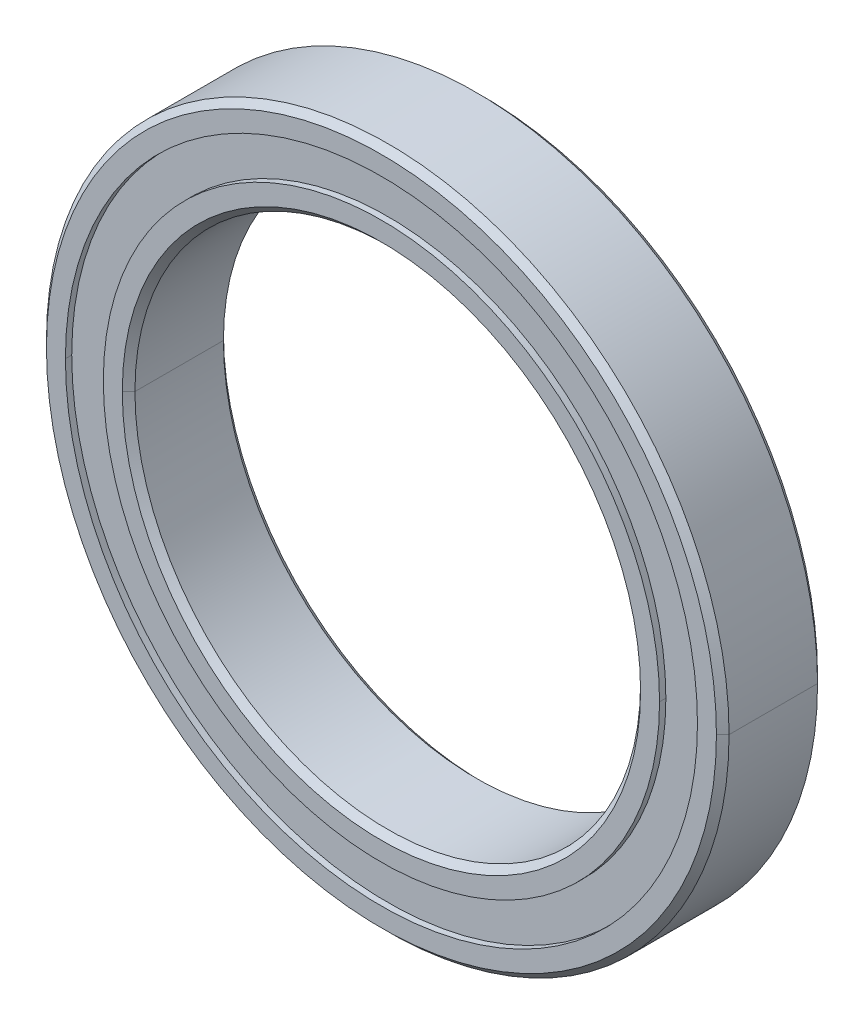
ISO-10303-21;
HEADER;
FILE_DESCRIPTION(('STEP AP214'),'2;1');
FILE_NAME('part.step','',(''),(''),'','','');
FILE_SCHEMA(('AUTOMOTIVE_DESIGN { 1 0 10303 214 1 1 1 1 }'));
ENDSEC;
DATA;
#1=APPLICATION_CONTEXT('core data for automotive mechanical design processes');
#2=APPLICATION_PROTOCOL_DEFINITION('international standard','automotive_design',2000,#1);
#3=PRODUCT_CONTEXT('',#1,'mechanical');
#4=PRODUCT('Part','Part','',(#3));
#5=PRODUCT_RELATED_PRODUCT_CATEGORY('part','',(#4));
#6=PRODUCT_DEFINITION_FORMATION('','',#4);
#7=PRODUCT_DEFINITION_CONTEXT('part definition',#1,'design');
#8=PRODUCT_DEFINITION('design','',#6,#7);
#9=PRODUCT_DEFINITION_SHAPE('','',#8);
#10=(LENGTH_UNIT() NAMED_UNIT(*) SI_UNIT(.MILLI.,.METRE.));
#11=(NAMED_UNIT(*) PLANE_ANGLE_UNIT() SI_UNIT($,.RADIAN.));
#12=(NAMED_UNIT(*) SI_UNIT($,.STERADIAN.) SOLID_ANGLE_UNIT());
#13=UNCERTAINTY_MEASURE_WITH_UNIT(LENGTH_MEASURE(1.E-05),#10,'distance_accuracy_value','');
#14=(GEOMETRIC_REPRESENTATION_CONTEXT(3) GLOBAL_UNCERTAINTY_ASSIGNED_CONTEXT((#13)) GLOBAL_UNIT_ASSIGNED_CONTEXT((#10,
#11,#12)) REPRESENTATION_CONTEXT('',''));
#15=CARTESIAN_POINT('',(0.,0.,0.));
#16=DIRECTION('',(0.,0.,1.));
#17=DIRECTION('',(1.,0.,0.));
#18=AXIS2_PLACEMENT_3D('',#15,#16,#17);
#19=CARTESIAN_POINT('',(0.,0.,2.));
#20=DIRECTION('',(0.,0.,-1.));
#21=DIRECTION('',(-1.,0.,0.));
#22=AXIS2_PLACEMENT_3D('',#19,#20,#21);
#23=CONICAL_SURFACE('',#22,13.2500000000001,0.785398163397435);
#24=DIRECTION('',(0.707106781186541,0.,-0.707106781186554));
#25=VECTOR('',#24,1.);
#26=CARTESIAN_POINT('',(13.2500000000001,0.,2.));
#27=LINE('',#26,#25);
#28=CARTESIAN_POINT('',(13.25,0.,2.));
#29=VERTEX_POINT('',#28);
#30=CARTESIAN_POINT('',(13.5,0.,1.75));
#31=VERTEX_POINT('',#30);
#32=EDGE_CURVE('E216',#29,#31,#27,.T.);
#33=ORIENTED_EDGE('',*,*,#32,.F.);
#34=CARTESIAN_POINT('',(0.,0.,2.));
#35=DIRECTION('',(0.,0.,1.));
#36=DIRECTION('',(1.,0.,0.));
#37=AXIS2_PLACEMENT_3D('',#34,#35,#36);
#38=CIRCLE('',#37,13.2500000000001);
#39=CARTESIAN_POINT('',(-13.25,0.,2.));
#40=VERTEX_POINT('',#39);
#41=EDGE_CURVE('E276',#40,#29,#38,.T.);
#42=ORIENTED_EDGE('',*,*,#41,.F.);
#43=DIRECTION('',(-0.707106781186541,0.,-0.707106781186554));
#44=VECTOR('',#43,1.);
#45=CARTESIAN_POINT('',(-13.2500000000001,0.,2.));
#46=LINE('',#45,#44);
#47=CARTESIAN_POINT('',(-13.5,0.,1.75));
#48=VERTEX_POINT('',#47);
#49=EDGE_CURVE('E215',#40,#48,#46,.T.);
#50=ORIENTED_EDGE('',*,*,#49,.T.);
#51=CARTESIAN_POINT('',(0.,0.,1.75));
#52=DIRECTION('',(0.,0.,-1.));
#53=DIRECTION('',(1.,0.,0.));
#54=AXIS2_PLACEMENT_3D('',#51,#52,#53);
#55=CIRCLE('',#54,13.5000000000001);
#56=EDGE_CURVE('E148',#31,#48,#55,.T.);
#57=ORIENTED_EDGE('',*,*,#56,.F.);
#58=EDGE_LOOP('',(#33,#42,#50,#57));
#59=FACE_BOUND('',#58,.T.);
#60=ADVANCED_FACE('F16',(#59),#23,.T.);
#61=CARTESIAN_POINT('',(0.,0.,-1.75));
#62=DIRECTION('',(0.,0.,1.));
#63=DIRECTION('',(1.,0.,0.));
#64=AXIS2_PLACEMENT_3D('',#61,#62,#63);
#65=CONICAL_SURFACE('',#64,13.5000000000001,0.785398163397452);
#66=DIRECTION('',(-0.707106781186554,0.,0.707106781186542));
#67=VECTOR('',#66,1.);
#68=CARTESIAN_POINT('',(-13.5000000000001,0.,-1.75));
#69=LINE('',#68,#67);
#70=CARTESIAN_POINT('',(-13.25,0.,-2.));
#71=VERTEX_POINT('',#70);
#72=CARTESIAN_POINT('',(-13.5,0.,-1.75));
#73=VERTEX_POINT('',#72);
#74=EDGE_CURVE('E279',#71,#73,#69,.T.);
#75=ORIENTED_EDGE('',*,*,#74,.F.);
#76=CARTESIAN_POINT('',(0.,0.,-2.));
#77=DIRECTION('',(0.,0.,-1.));
#78=DIRECTION('',(1.,0.,0.));
#79=AXIS2_PLACEMENT_3D('',#76,#77,#78);
#80=CIRCLE('',#79,13.2500000000001);
#81=CARTESIAN_POINT('',(13.2500000000001,0.,-2.));
#82=VERTEX_POINT('',#81);
#83=EDGE_CURVE('E149',#82,#71,#80,.T.);
#84=ORIENTED_EDGE('',*,*,#83,.F.);
#85=DIRECTION('',(0.707106781186554,0.,0.707106781186542));
#86=VECTOR('',#85,1.);
#87=CARTESIAN_POINT('',(13.5000000000001,0.,-1.75));
#88=LINE('',#87,#86);
#89=CARTESIAN_POINT('',(13.5,0.,-1.75));
#90=VERTEX_POINT('',#89);
#91=EDGE_CURVE('E197',#82,#90,#88,.T.);
#92=ORIENTED_EDGE('',*,*,#91,.T.);
#93=CARTESIAN_POINT('',(0.,0.,-1.75));
#94=DIRECTION('',(0.,0.,1.));
#95=DIRECTION('',(1.,0.,0.));
#96=AXIS2_PLACEMENT_3D('',#93,#94,#95);
#97=CIRCLE('',#96,13.5000000000001);
#98=EDGE_CURVE('E283',#73,#90,#97,.T.);
#99=ORIENTED_EDGE('',*,*,#98,.F.);
#100=EDGE_LOOP('',(#75,#84,#92,#99));
#101=FACE_BOUND('',#100,.T.);
#102=ADVANCED_FACE('F18',(#101),#65,.T.);
#103=CARTESIAN_POINT('',(0.,0.,1.75));
#104=DIRECTION('',(0.,0.,1.));
#105=DIRECTION('',(1.,0.,0.));
#106=AXIS2_PLACEMENT_3D('',#103,#104,#105);
#107=CONICAL_SURFACE('',#106,10.,0.785398163397455);
#108=DIRECTION('',(-0.707106781186556,0.,0.707106781186539));
#109=VECTOR('',#108,1.);
#110=CARTESIAN_POINT('',(-10.,0.,1.75));
#111=LINE('',#110,#109);
#112=CARTESIAN_POINT('',(-10.,0.,1.75));
#113=VERTEX_POINT('',#112);
#114=CARTESIAN_POINT('',(-10.25,0.,2.));
#115=VERTEX_POINT('',#114);
#116=EDGE_CURVE('E185',#113,#115,#111,.T.);
#117=ORIENTED_EDGE('',*,*,#116,.F.);
#118=CARTESIAN_POINT('',(0.,0.,1.75));
#119=DIRECTION('',(0.,0.,1.));
#120=DIRECTION('',(1.,0.,0.));
#121=AXIS2_PLACEMENT_3D('',#118,#119,#120);
#122=CIRCLE('',#121,10.);
#123=CARTESIAN_POINT('',(10.,0.,1.75));
#124=VERTEX_POINT('',#123);
#125=EDGE_CURVE('E285',#124,#113,#122,.T.);
#126=ORIENTED_EDGE('',*,*,#125,.F.);
#127=DIRECTION('',(0.707106781186556,0.,0.707106781186539));
#128=VECTOR('',#127,1.);
#129=CARTESIAN_POINT('',(10.,0.,1.75));
#130=LINE('',#129,#128);
#131=CARTESIAN_POINT('',(10.25,0.,2.));
#132=VERTEX_POINT('',#131);
#133=EDGE_CURVE('E184',#124,#132,#130,.T.);
#134=ORIENTED_EDGE('',*,*,#133,.T.);
#135=CARTESIAN_POINT('',(0.,0.,2.));
#136=DIRECTION('',(0.,0.,-1.));
#137=DIRECTION('',(1.,0.,0.));
#138=AXIS2_PLACEMENT_3D('',#135,#136,#137);
#139=CIRCLE('',#138,10.25);
#140=EDGE_CURVE('E249',#115,#132,#139,.T.);
#141=ORIENTED_EDGE('',*,*,#140,.F.);
#142=EDGE_LOOP('',(#117,#126,#134,#141));
#143=FACE_BOUND('',#142,.T.);
#144=ADVANCED_FACE('F369',(#143),#107,.F.);
#145=CARTESIAN_POINT('',(0.,0.,-2.));
#146=DIRECTION('',(0.,0.,-1.));
#147=DIRECTION('',(-1.,0.,0.));
#148=AXIS2_PLACEMENT_3D('',#145,#146,#147);
#149=CONICAL_SURFACE('',#148,10.25,0.785398163397442);
#150=DIRECTION('',(0.707106781186546,0.,-0.707106781186549));
#151=VECTOR('',#150,1.);
#152=CARTESIAN_POINT('',(10.25,0.,-2.));
#153=LINE('',#152,#151);
#154=CARTESIAN_POINT('',(10.,0.,-1.75));
#155=VERTEX_POINT('',#154);
#156=CARTESIAN_POINT('',(10.25,0.,-2.));
#157=VERTEX_POINT('',#156);
#158=EDGE_CURVE('E187',#155,#157,#153,.T.);
#159=ORIENTED_EDGE('',*,*,#158,.F.);
#160=CARTESIAN_POINT('',(0.,0.,-1.75));
#161=DIRECTION('',(0.,0.,-1.));
#162=DIRECTION('',(1.,0.,0.));
#163=AXIS2_PLACEMENT_3D('',#160,#161,#162);
#164=CIRCLE('',#163,10.);
#165=CARTESIAN_POINT('',(-10.,0.,-1.75));
#166=VERTEX_POINT('',#165);
#167=EDGE_CURVE('E339',#166,#155,#164,.T.);
#168=ORIENTED_EDGE('',*,*,#167,.F.);
#169=DIRECTION('',(-0.707106781186546,0.,-0.707106781186549));
#170=VECTOR('',#169,1.);
#171=CARTESIAN_POINT('',(-10.25,0.,-2.));
#172=LINE('',#171,#170);
#173=CARTESIAN_POINT('',(-10.25,0.,-2.));
#174=VERTEX_POINT('',#173);
#175=EDGE_CURVE('E245',#166,#174,#172,.T.);
#176=ORIENTED_EDGE('',*,*,#175,.T.);
#177=CARTESIAN_POINT('',(0.,0.,-2.));
#178=DIRECTION('',(0.,0.,1.));
#179=DIRECTION('',(1.,0.,0.));
#180=AXIS2_PLACEMENT_3D('',#177,#178,#179);
#181=CIRCLE('',#180,10.25);
#182=EDGE_CURVE('E250',#157,#174,#181,.T.);
#183=ORIENTED_EDGE('',*,*,#182,.F.);
#184=EDGE_LOOP('',(#159,#168,#176,#183));
#185=FACE_BOUND('',#184,.T.);
#186=ADVANCED_FACE('F462',(#185),#149,.F.);
#187=CARTESIAN_POINT('',(0.,0.,-1.75));
#188=DIRECTION('',(0.,0.,-1.));
#189=DIRECTION('',(-1.,0.,0.));
#190=AXIS2_PLACEMENT_3D('',#187,#188,#189);
#191=CYLINDRICAL_SURFACE('',#190,11.);
#192=DIRECTION('',(0.,0.,-1.));
#193=VECTOR('',#192,1.);
#194=CARTESIAN_POINT('',(11.,0.,-1.75));
#195=LINE('',#194,#193);
#196=CARTESIAN_POINT('',(11.,0.,-1.75));
#197=VERTEX_POINT('',#196);
#198=CARTESIAN_POINT('',(11.,0.,-2.));
#199=VERTEX_POINT('',#198);
#200=EDGE_CURVE('E244',#197,#199,#195,.T.);
#201=ORIENTED_EDGE('',*,*,#200,.F.);
#202=CARTESIAN_POINT('',(0.,0.,-1.75));
#203=DIRECTION('',(0.,0.,1.));
#204=DIRECTION('',(1.,0.,0.));
#205=AXIS2_PLACEMENT_3D('',#202,#203,#204);
#206=CIRCLE('',#205,11.);
#207=CARTESIAN_POINT('',(-11.,0.,-1.75));
#208=VERTEX_POINT('',#207);
#209=EDGE_CURVE('E11',#208,#197,#206,.T.);
#210=ORIENTED_EDGE('',*,*,#209,.F.);
#211=DIRECTION('',(0.,0.,-1.));
#212=VECTOR('',#211,1.);
#213=CARTESIAN_POINT('',(-11.,0.,-1.75));
#214=LINE('',#213,#212);
#215=CARTESIAN_POINT('',(-11.,0.,-2.));
#216=VERTEX_POINT('',#215);
#217=EDGE_CURVE('E20',#208,#216,#214,.T.);
#218=ORIENTED_EDGE('',*,*,#217,.T.);
#219=CARTESIAN_POINT('',(0.,0.,-2.));
#220=DIRECTION('',(0.,0.,1.));
#221=DIRECTION('',(1.,0.,0.));
#222=AXIS2_PLACEMENT_3D('',#219,#220,#221);
#223=CIRCLE('',#222,11.);
#224=EDGE_CURVE('E310',#216,#199,#223,.T.);
#225=ORIENTED_EDGE('',*,*,#224,.T.);
#226=EDGE_LOOP('',(#201,#210,#218,#225));
#227=FACE_BOUND('',#226,.T.);
#228=ADVANCED_FACE('F373',(#227),#191,.T.);
#229=CARTESIAN_POINT('',(0.,0.,-1.75));
#230=DIRECTION('',(0.,0.,-1.));
#231=DIRECTION('',(-1.,0.,0.));
#232=AXIS2_PLACEMENT_3D('',#229,#230,#231);
#233=CYLINDRICAL_SURFACE('',#232,12.5000000000001);
#234=DIRECTION('',(0.,0.,-1.));
#235=VECTOR('',#234,1.);
#236=CARTESIAN_POINT('',(12.5000000000001,0.,-1.75));
#237=LINE('',#236,#235);
#238=CARTESIAN_POINT('',(12.5,0.,-1.75));
#239=VERTEX_POINT('',#238);
#240=CARTESIAN_POINT('',(12.5,0.,-2.));
#241=VERTEX_POINT('',#240);
#242=EDGE_CURVE('E141',#239,#241,#237,.T.);
#243=ORIENTED_EDGE('',*,*,#242,.F.);
#244=CARTESIAN_POINT('',(0.,0.,-1.75));
#245=DIRECTION('',(0.,0.,1.));
#246=DIRECTION('',(1.,0.,0.));
#247=AXIS2_PLACEMENT_3D('',#244,#245,#246);
#248=CIRCLE('',#247,12.5000000000001);
#249=CARTESIAN_POINT('',(-12.5,0.,-1.75));
#250=VERTEX_POINT('',#249);
#251=EDGE_CURVE('E27',#239,#250,#248,.T.);
#252=ORIENTED_EDGE('',*,*,#251,.T.);
#253=DIRECTION('',(0.,0.,-1.));
#254=VECTOR('',#253,1.);
#255=CARTESIAN_POINT('',(-12.5000000000001,0.,-1.75));
#256=LINE('',#255,#254);
#257=CARTESIAN_POINT('',(-12.5,0.,-2.));
#258=VERTEX_POINT('',#257);
#259=EDGE_CURVE('E144',#250,#258,#256,.T.);
#260=ORIENTED_EDGE('',*,*,#259,.T.);
#261=CARTESIAN_POINT('',(0.,0.,-2.));
#262=DIRECTION('',(0.,0.,1.));
#263=DIRECTION('',(1.,0.,0.));
#264=AXIS2_PLACEMENT_3D('',#261,#262,#263);
#265=CIRCLE('',#264,12.5000000000001);
#266=EDGE_CURVE('E136',#241,#258,#265,.T.);
#267=ORIENTED_EDGE('',*,*,#266,.F.);
#268=EDGE_LOOP('',(#243,#252,#260,#267));
#269=FACE_BOUND('',#268,.T.);
#270=ADVANCED_FACE('F138',(#269),#233,.F.);
#271=CARTESIAN_POINT('',(0.,0.,-1.75));
#272=DIRECTION('',(0.,0.,-1.));
#273=DIRECTION('',(-1.,0.,0.));
#274=AXIS2_PLACEMENT_3D('',#271,#272,#273);
#275=PLANE('',#274);
#276=ORIENTED_EDGE('',*,*,#209,.T.);
#277=CARTESIAN_POINT('',(0.,0.,-1.75));
#278=DIRECTION('',(0.,0.,1.));
#279=DIRECTION('',(1.,0.,0.));
#280=AXIS2_PLACEMENT_3D('',#277,#278,#279);
#281=CIRCLE('',#280,11.);
#282=EDGE_CURVE('E240',#197,#208,#281,.T.);
#283=ORIENTED_EDGE('',*,*,#282,.T.);
#284=EDGE_LOOP('',(#276,#283));
#285=FACE_BOUND('',#284,.T.);
#286=CARTESIAN_POINT('',(0.,0.,-1.75));
#287=DIRECTION('',(0.,0.,1.));
#288=DIRECTION('',(1.,0.,0.));
#289=AXIS2_PLACEMENT_3D('',#286,#287,#288);
#290=CIRCLE('',#289,12.5000000000001);
#291=EDGE_CURVE('E159',#250,#239,#290,.T.);
#292=ORIENTED_EDGE('',*,*,#291,.F.);
#293=ORIENTED_EDGE('',*,*,#251,.F.);
#294=EDGE_LOOP('',(#292,#293));
#295=FACE_BOUND('',#294,.T.);
#296=ADVANCED_FACE('F386',(#285,#295),#275,.T.);
#297=CARTESIAN_POINT('',(0.,0.,1.75));
#298=DIRECTION('',(0.,0.,1.));
#299=DIRECTION('',(1.,0.,0.));
#300=AXIS2_PLACEMENT_3D('',#297,#298,#299);
#301=CYLINDRICAL_SURFACE('',#300,11.);
#302=DIRECTION('',(0.,0.,1.));
#303=VECTOR('',#302,1.);
#304=CARTESIAN_POINT('',(-11.,0.,1.75));
#305=LINE('',#304,#303);
#306=CARTESIAN_POINT('',(-11.,0.,1.75));
#307=VERTEX_POINT('',#306);
#308=CARTESIAN_POINT('',(-11.,0.,2.));
#309=VERTEX_POINT('',#308);
#310=EDGE_CURVE('E201',#307,#309,#305,.T.);
#311=ORIENTED_EDGE('',*,*,#310,.F.);
#312=CARTESIAN_POINT('',(0.,0.,1.75));
#313=DIRECTION('',(0.,0.,1.));
#314=DIRECTION('',(1.,0.,0.));
#315=AXIS2_PLACEMENT_3D('',#312,#313,#314);
#316=CIRCLE('',#315,11.);
#317=CARTESIAN_POINT('',(11.,0.,1.75));
#318=VERTEX_POINT('',#317);
#319=EDGE_CURVE('E172',#307,#318,#316,.T.);
#320=ORIENTED_EDGE('',*,*,#319,.T.);
#321=DIRECTION('',(0.,0.,1.));
#322=VECTOR('',#321,1.);
#323=CARTESIAN_POINT('',(11.,0.,1.75));
#324=LINE('',#323,#322);
#325=CARTESIAN_POINT('',(11.,0.,2.));
#326=VERTEX_POINT('',#325);
#327=EDGE_CURVE('E175',#318,#326,#324,.T.);
#328=ORIENTED_EDGE('',*,*,#327,.T.);
#329=CARTESIAN_POINT('',(0.,0.,2.));
#330=DIRECTION('',(0.,0.,1.));
#331=DIRECTION('',(1.,0.,0.));
#332=AXIS2_PLACEMENT_3D('',#329,#330,#331);
#333=CIRCLE('',#332,11.);
#334=EDGE_CURVE('E246',#309,#326,#333,.T.);
#335=ORIENTED_EDGE('',*,*,#334,.F.);
#336=EDGE_LOOP('',(#311,#320,#328,#335));
#337=FACE_BOUND('',#336,.T.);
#338=ADVANCED_FACE('F381',(#337),#301,.T.);
#339=CARTESIAN_POINT('',(0.,0.,1.75));
#340=DIRECTION('',(0.,0.,1.));
#341=DIRECTION('',(0.,-1.,0.));
#342=AXIS2_PLACEMENT_3D('',#339,#340,#341);
#343=PLANE('',#342);
#344=CARTESIAN_POINT('',(0.,0.,1.75));
#345=DIRECTION('',(0.,0.,1.));
#346=DIRECTION('',(1.,0.,0.));
#347=AXIS2_PLACEMENT_3D('',#344,#345,#346);
#348=CIRCLE('',#347,11.);
#349=EDGE_CURVE('E239',#318,#307,#348,.T.);
#350=ORIENTED_EDGE('',*,*,#349,.F.);
#351=ORIENTED_EDGE('',*,*,#319,.F.);
#352=EDGE_LOOP('',(#350,#351));
#353=FACE_BOUND('',#352,.T.);
#354=CARTESIAN_POINT('',(0.,0.,1.75));
#355=DIRECTION('',(0.,0.,1.));
#356=DIRECTION('',(1.,0.,0.));
#357=AXIS2_PLACEMENT_3D('',#354,#355,#356);
#358=CIRCLE('',#357,12.5000000000001);
#359=CARTESIAN_POINT('',(12.5000000000001,0.,1.75));
#360=VERTEX_POINT('',#359);
#361=CARTESIAN_POINT('',(-12.5,0.,1.75));
#362=VERTEX_POINT('',#361);
#363=EDGE_CURVE('E174',#360,#362,#358,.T.);
#364=ORIENTED_EDGE('',*,*,#363,.T.);
#365=CARTESIAN_POINT('',(0.,0.,1.75));
#366=DIRECTION('',(0.,0.,1.));
#367=DIRECTION('',(1.,0.,0.));
#368=AXIS2_PLACEMENT_3D('',#365,#366,#367);
#369=CIRCLE('',#368,12.5000000000001);
#370=EDGE_CURVE('E179',#362,#360,#369,.T.);
#371=ORIENTED_EDGE('',*,*,#370,.T.);
#372=EDGE_LOOP('',(#364,#371));
#373=FACE_BOUND('',#372,.T.);
#374=ADVANCED_FACE('F378',(#353,#373),#343,.T.);
#375=CARTESIAN_POINT('',(0.,0.,1.75));
#376=DIRECTION('',(0.,0.,1.));
#377=DIRECTION('',(1.,0.,0.));
#378=AXIS2_PLACEMENT_3D('',#375,#376,#377);
#379=CYLINDRICAL_SURFACE('',#378,12.5000000000001);
#380=DIRECTION('',(0.,0.,1.));
#381=VECTOR('',#380,1.);
#382=CARTESIAN_POINT('',(-12.5000000000001,0.,1.75));
#383=LINE('',#382,#381);
#384=CARTESIAN_POINT('',(-12.5,0.,2.));
#385=VERTEX_POINT('',#384);
#386=EDGE_CURVE('E221',#362,#385,#383,.T.);
#387=ORIENTED_EDGE('',*,*,#386,.F.);
#388=ORIENTED_EDGE('',*,*,#363,.F.);
#389=DIRECTION('',(0.,0.,1.));
#390=VECTOR('',#389,1.);
#391=CARTESIAN_POINT('',(12.5000000000001,0.,1.75));
#392=LINE('',#391,#390);
#393=CARTESIAN_POINT('',(12.5000000000001,0.,2.));
#394=VERTEX_POINT('',#393);
#395=EDGE_CURVE('E226',#360,#394,#392,.T.);
#396=ORIENTED_EDGE('',*,*,#395,.T.);
#397=CARTESIAN_POINT('',(0.,0.,2.));
#398=DIRECTION('',(0.,0.,1.));
#399=DIRECTION('',(1.,0.,0.));
#400=AXIS2_PLACEMENT_3D('',#397,#398,#399);
#401=CIRCLE('',#400,12.5000000000001);
#402=EDGE_CURVE('E41',#394,#385,#401,.T.);
#403=ORIENTED_EDGE('',*,*,#402,.T.);
#404=EDGE_LOOP('',(#387,#388,#396,#403));
#405=FACE_BOUND('',#404,.T.);
#406=ADVANCED_FACE('F375',(#405),#379,.F.);
#407=CARTESIAN_POINT('',(0.,0.,2.));
#408=DIRECTION('',(0.,0.,-1.));
#409=DIRECTION('',(-1.,0.,0.));
#410=AXIS2_PLACEMENT_3D('',#407,#408,#409);
#411=CYLINDRICAL_SURFACE('',#410,10.);
#412=DIRECTION('',(0.,0.,-1.));
#413=VECTOR('',#412,1.);
#414=CARTESIAN_POINT('',(10.,0.,2.));
#415=LINE('',#414,#413);
#416=EDGE_CURVE('E222',#124,#155,#415,.T.);
#417=ORIENTED_EDGE('',*,*,#416,.F.);
#418=ORIENTED_EDGE('',*,*,#125,.T.);
#419=DIRECTION('',(0.,0.,-1.));
#420=VECTOR('',#419,1.);
#421=CARTESIAN_POINT('',(-10.,0.,2.));
#422=LINE('',#421,#420);
#423=EDGE_CURVE('E170',#113,#166,#422,.T.);
#424=ORIENTED_EDGE('',*,*,#423,.T.);
#425=ORIENTED_EDGE('',*,*,#167,.T.);
#426=EDGE_LOOP('',(#417,#418,#424,#425));
#427=FACE_BOUND('',#426,.T.);
#428=ADVANCED_FACE('F359',(#427),#411,.F.);
#429=CARTESIAN_POINT('',(0.,0.,2.));
#430=DIRECTION('',(0.,0.,-1.));
#431=DIRECTION('',(-1.,0.,0.));
#432=AXIS2_PLACEMENT_3D('',#429,#430,#431);
#433=CYLINDRICAL_SURFACE('',#432,13.5000000000001);
#434=DIRECTION('',(0.,0.,-1.));
#435=VECTOR('',#434,1.);
#436=CARTESIAN_POINT('',(13.5000000000001,0.,2.));
#437=LINE('',#436,#435);
#438=EDGE_CURVE('E205',#31,#90,#437,.T.);
#439=ORIENTED_EDGE('',*,*,#438,.F.);
#440=ORIENTED_EDGE('',*,*,#56,.T.);
#441=DIRECTION('',(0.,0.,-1.));
#442=VECTOR('',#441,1.);
#443=CARTESIAN_POINT('',(-13.5000000000001,0.,2.));
#444=LINE('',#443,#442);
#445=EDGE_CURVE('E209',#48,#73,#444,.T.);
#446=ORIENTED_EDGE('',*,*,#445,.T.);
#447=ORIENTED_EDGE('',*,*,#98,.T.);
#448=EDGE_LOOP('',(#439,#440,#446,#447));
#449=FACE_BOUND('',#448,.T.);
#450=ADVANCED_FACE('F307',(#449),#433,.T.);
#451=CARTESIAN_POINT('',(0.,0.,-2.));
#452=DIRECTION('',(0.,0.,1.));
#453=DIRECTION('',(0.,-1.,0.));
#454=AXIS2_PLACEMENT_3D('',#451,#452,#453);
#455=PLANE('',#454);
#456=CARTESIAN_POINT('',(0.,0.,-2.));
#457=DIRECTION('',(0.,0.,1.));
#458=DIRECTION('',(1.,0.,0.));
#459=AXIS2_PLACEMENT_3D('',#456,#457,#458);
#460=CIRCLE('',#459,12.5000000000001);
#461=EDGE_CURVE('E151',#258,#241,#460,.T.);
#462=ORIENTED_EDGE('',*,*,#461,.T.);
#463=ORIENTED_EDGE('',*,*,#266,.T.);
#464=EDGE_LOOP('',(#462,#463));
#465=FACE_BOUND('',#464,.T.);
#466=ORIENTED_EDGE('',*,*,#83,.T.);
#467=CARTESIAN_POINT('',(0.,0.,-2.));
#468=DIRECTION('',(0.,0.,-1.));
#469=DIRECTION('',(1.,0.,0.));
#470=AXIS2_PLACEMENT_3D('',#467,#468,#469);
#471=CIRCLE('',#470,13.2500000000001);
#472=EDGE_CURVE('E275',#71,#82,#471,.T.);
#473=ORIENTED_EDGE('',*,*,#472,.T.);
#474=EDGE_LOOP('',(#466,#473));
#475=FACE_BOUND('',#474,.T.);
#476=ADVANCED_FACE('F152',(#465,#475),#455,.F.);
#477=CARTESIAN_POINT('',(0.,0.,2.));
#478=DIRECTION('',(0.,0.,1.));
#479=DIRECTION('',(0.,-1.,0.));
#480=AXIS2_PLACEMENT_3D('',#477,#478,#479);
#481=PLANE('',#480);
#482=ORIENTED_EDGE('',*,*,#402,.F.);
#483=CARTESIAN_POINT('',(0.,0.,2.));
#484=DIRECTION('',(0.,0.,1.));
#485=DIRECTION('',(1.,0.,0.));
#486=AXIS2_PLACEMENT_3D('',#483,#484,#485);
#487=CIRCLE('',#486,12.5000000000001);
#488=EDGE_CURVE('E229',#385,#394,#487,.T.);
#489=ORIENTED_EDGE('',*,*,#488,.F.);
#490=EDGE_LOOP('',(#482,#489));
#491=FACE_BOUND('',#490,.T.);
#492=ORIENTED_EDGE('',*,*,#41,.T.);
#493=CARTESIAN_POINT('',(0.,0.,2.));
#494=DIRECTION('',(0.,0.,1.));
#495=DIRECTION('',(1.,0.,0.));
#496=AXIS2_PLACEMENT_3D('',#493,#494,#495);
#497=CIRCLE('',#496,13.2500000000001);
#498=EDGE_CURVE('E340',#29,#40,#497,.T.);
#499=ORIENTED_EDGE('',*,*,#498,.T.);
#500=EDGE_LOOP('',(#492,#499));
#501=FACE_BOUND('',#500,.T.);
#502=ADVANCED_FACE('F350',(#491,#501),#481,.T.);
#503=CARTESIAN_POINT('',(0.,0.,2.));
#504=DIRECTION('',(0.,0.,1.));
#505=DIRECTION('',(0.,-1.,0.));
#506=AXIS2_PLACEMENT_3D('',#503,#504,#505);
#507=PLANE('',#506);
#508=CARTESIAN_POINT('',(0.,0.,2.));
#509=DIRECTION('',(0.,0.,-1.));
#510=DIRECTION('',(1.,0.,0.));
#511=AXIS2_PLACEMENT_3D('',#508,#509,#510);
#512=CIRCLE('',#511,10.25);
#513=EDGE_CURVE('E181',#132,#115,#512,.T.);
#514=ORIENTED_EDGE('',*,*,#513,.T.);
#515=ORIENTED_EDGE('',*,*,#140,.T.);
#516=EDGE_LOOP('',(#514,#515));
#517=FACE_BOUND('',#516,.T.);
#518=CARTESIAN_POINT('',(0.,0.,2.));
#519=DIRECTION('',(0.,0.,1.));
#520=DIRECTION('',(1.,0.,0.));
#521=AXIS2_PLACEMENT_3D('',#518,#519,#520);
#522=CIRCLE('',#521,11.);
#523=EDGE_CURVE('E180',#326,#309,#522,.T.);
#524=ORIENTED_EDGE('',*,*,#523,.T.);
#525=ORIENTED_EDGE('',*,*,#334,.T.);
#526=EDGE_LOOP('',(#524,#525));
#527=FACE_BOUND('',#526,.T.);
#528=ADVANCED_FACE('F357',(#517,#527),#507,.T.);
#529=CARTESIAN_POINT('',(0.,0.,-2.));
#530=DIRECTION('',(0.,0.,1.));
#531=DIRECTION('',(0.,-1.,0.));
#532=AXIS2_PLACEMENT_3D('',#529,#530,#531);
#533=PLANE('',#532);
#534=CARTESIAN_POINT('',(0.,0.,-2.));
#535=DIRECTION('',(0.,0.,1.));
#536=DIRECTION('',(1.,0.,0.));
#537=AXIS2_PLACEMENT_3D('',#534,#535,#536);
#538=CIRCLE('',#537,10.25);
#539=EDGE_CURVE('E191',#174,#157,#538,.T.);
#540=ORIENTED_EDGE('',*,*,#539,.T.);
#541=ORIENTED_EDGE('',*,*,#182,.T.);
#542=EDGE_LOOP('',(#540,#541));
#543=FACE_BOUND('',#542,.T.);
#544=ORIENTED_EDGE('',*,*,#224,.F.);
#545=CARTESIAN_POINT('',(0.,0.,-2.));
#546=DIRECTION('',(0.,0.,1.));
#547=DIRECTION('',(1.,0.,0.));
#548=AXIS2_PLACEMENT_3D('',#545,#546,#547);
#549=CIRCLE('',#548,11.);
#550=EDGE_CURVE('E253',#199,#216,#549,.T.);
#551=ORIENTED_EDGE('',*,*,#550,.F.);
#552=EDGE_LOOP('',(#544,#551));
#553=FACE_BOUND('',#552,.T.);
#554=ADVANCED_FACE('F401',(#543,#553),#533,.F.);
#555=CARTESIAN_POINT('',(0.,0.,2.));
#556=DIRECTION('',(0.,0.,-1.));
#557=DIRECTION('',(-1.,0.,0.));
#558=AXIS2_PLACEMENT_3D('',#555,#556,#557);
#559=CYLINDRICAL_SURFACE('',#558,13.5000000000001);
#560=CARTESIAN_POINT('',(0.,0.,1.75));
#561=DIRECTION('',(0.,0.,-1.));
#562=DIRECTION('',(1.,0.,0.));
#563=AXIS2_PLACEMENT_3D('',#560,#561,#562);
#564=CIRCLE('',#563,13.5000000000001);
#565=EDGE_CURVE('E212',#48,#31,#564,.T.);
#566=ORIENTED_EDGE('',*,*,#565,.T.);
#567=ORIENTED_EDGE('',*,*,#438,.T.);
#568=CARTESIAN_POINT('',(0.,0.,-1.75));
#569=DIRECTION('',(0.,0.,1.));
#570=DIRECTION('',(1.,0.,0.));
#571=AXIS2_PLACEMENT_3D('',#568,#569,#570);
#572=CIRCLE('',#571,13.5000000000001);
#573=EDGE_CURVE('E233',#90,#73,#572,.T.);
#574=ORIENTED_EDGE('',*,*,#573,.T.);
#575=ORIENTED_EDGE('',*,*,#445,.F.);
#576=EDGE_LOOP('',(#566,#567,#574,#575));
#577=FACE_BOUND('',#576,.T.);
#578=ADVANCED_FACE('F293',(#577),#559,.T.);
#579=CARTESIAN_POINT('',(0.,0.,2.));
#580=DIRECTION('',(0.,0.,-1.));
#581=DIRECTION('',(-1.,0.,0.));
#582=AXIS2_PLACEMENT_3D('',#579,#580,#581);
#583=CYLINDRICAL_SURFACE('',#582,10.);
#584=CARTESIAN_POINT('',(0.,0.,1.75));
#585=DIRECTION('',(0.,0.,1.));
#586=DIRECTION('',(1.,0.,0.));
#587=AXIS2_PLACEMENT_3D('',#584,#585,#586);
#588=CIRCLE('',#587,10.);
#589=EDGE_CURVE('E193',#113,#124,#588,.T.);
#590=ORIENTED_EDGE('',*,*,#589,.T.);
#591=ORIENTED_EDGE('',*,*,#416,.T.);
#592=CARTESIAN_POINT('',(0.,0.,-1.75));
#593=DIRECTION('',(0.,0.,-1.));
#594=DIRECTION('',(1.,0.,0.));
#595=AXIS2_PLACEMENT_3D('',#592,#593,#594);
#596=CIRCLE('',#595,10.);
#597=EDGE_CURVE('E192',#155,#166,#596,.T.);
#598=ORIENTED_EDGE('',*,*,#597,.T.);
#599=ORIENTED_EDGE('',*,*,#423,.F.);
#600=EDGE_LOOP('',(#590,#591,#598,#599));
#601=FACE_BOUND('',#600,.T.);
#602=ADVANCED_FACE('F388',(#601),#583,.F.);
#603=CARTESIAN_POINT('',(0.,0.,1.75));
#604=DIRECTION('',(0.,0.,1.));
#605=DIRECTION('',(1.,0.,0.));
#606=AXIS2_PLACEMENT_3D('',#603,#604,#605);
#607=CYLINDRICAL_SURFACE('',#606,12.5000000000001);
#608=ORIENTED_EDGE('',*,*,#370,.F.);
#609=ORIENTED_EDGE('',*,*,#386,.T.);
#610=ORIENTED_EDGE('',*,*,#488,.T.);
#611=ORIENTED_EDGE('',*,*,#395,.F.);
#612=EDGE_LOOP('',(#608,#609,#610,#611));
#613=FACE_BOUND('',#612,.T.);
#614=ADVANCED_FACE('F391',(#613),#607,.F.);
#615=CARTESIAN_POINT('',(0.,0.,1.75));
#616=DIRECTION('',(0.,0.,1.));
#617=DIRECTION('',(1.,0.,0.));
#618=AXIS2_PLACEMENT_3D('',#615,#616,#617);
#619=CYLINDRICAL_SURFACE('',#618,11.);
#620=ORIENTED_EDGE('',*,*,#349,.T.);
#621=ORIENTED_EDGE('',*,*,#310,.T.);
#622=ORIENTED_EDGE('',*,*,#523,.F.);
#623=ORIENTED_EDGE('',*,*,#327,.F.);
#624=EDGE_LOOP('',(#620,#621,#622,#623));
#625=FACE_BOUND('',#624,.T.);
#626=ADVANCED_FACE('F396',(#625),#619,.T.);
#627=CARTESIAN_POINT('',(0.,0.,-1.75));
#628=DIRECTION('',(0.,0.,-1.));
#629=DIRECTION('',(-1.,0.,0.));
#630=AXIS2_PLACEMENT_3D('',#627,#628,#629);
#631=CYLINDRICAL_SURFACE('',#630,12.5000000000001);
#632=ORIENTED_EDGE('',*,*,#291,.T.);
#633=ORIENTED_EDGE('',*,*,#242,.T.);
#634=ORIENTED_EDGE('',*,*,#461,.F.);
#635=ORIENTED_EDGE('',*,*,#259,.F.);
#636=EDGE_LOOP('',(#632,#633,#634,#635));
#637=FACE_BOUND('',#636,.T.);
#638=ADVANCED_FACE('F157',(#637),#631,.F.);
#639=CARTESIAN_POINT('',(0.,0.,-1.75));
#640=DIRECTION('',(0.,0.,-1.));
#641=DIRECTION('',(-1.,0.,0.));
#642=AXIS2_PLACEMENT_3D('',#639,#640,#641);
#643=CYLINDRICAL_SURFACE('',#642,11.);
#644=ORIENTED_EDGE('',*,*,#282,.F.);
#645=ORIENTED_EDGE('',*,*,#200,.T.);
#646=ORIENTED_EDGE('',*,*,#550,.T.);
#647=ORIENTED_EDGE('',*,*,#217,.F.);
#648=EDGE_LOOP('',(#644,#645,#646,#647));
#649=FACE_BOUND('',#648,.T.);
#650=ADVANCED_FACE('F417',(#649),#643,.T.);
#651=CARTESIAN_POINT('',(0.,0.,-2.));
#652=DIRECTION('',(0.,0.,-1.));
#653=DIRECTION('',(-1.,0.,0.));
#654=AXIS2_PLACEMENT_3D('',#651,#652,#653);
#655=CONICAL_SURFACE('',#654,10.25,0.785398163397442);
#656=ORIENTED_EDGE('',*,*,#597,.F.);
#657=ORIENTED_EDGE('',*,*,#158,.T.);
#658=ORIENTED_EDGE('',*,*,#539,.F.);
#659=ORIENTED_EDGE('',*,*,#175,.F.);
#660=EDGE_LOOP('',(#656,#657,#658,#659));
#661=FACE_BOUND('',#660,.T.);
#662=ADVANCED_FACE('F458',(#661),#655,.F.);
#663=CARTESIAN_POINT('',(0.,0.,1.75));
#664=DIRECTION('',(0.,0.,1.));
#665=DIRECTION('',(1.,0.,0.));
#666=AXIS2_PLACEMENT_3D('',#663,#664,#665);
#667=CONICAL_SURFACE('',#666,10.,0.785398163397455);
#668=ORIENTED_EDGE('',*,*,#589,.F.);
#669=ORIENTED_EDGE('',*,*,#116,.T.);
#670=ORIENTED_EDGE('',*,*,#513,.F.);
#671=ORIENTED_EDGE('',*,*,#133,.F.);
#672=EDGE_LOOP('',(#668,#669,#670,#671));
#673=FACE_BOUND('',#672,.T.);
#674=ADVANCED_FACE('F450',(#673),#667,.F.);
#675=CARTESIAN_POINT('',(0.,0.,-1.75));
#676=DIRECTION('',(0.,0.,1.));
#677=DIRECTION('',(1.,0.,0.));
#678=AXIS2_PLACEMENT_3D('',#675,#676,#677);
#679=CONICAL_SURFACE('',#678,13.5000000000001,0.785398163397452);
#680=ORIENTED_EDGE('',*,*,#472,.F.);
#681=ORIENTED_EDGE('',*,*,#74,.T.);
#682=ORIENTED_EDGE('',*,*,#573,.F.);
#683=ORIENTED_EDGE('',*,*,#91,.F.);
#684=EDGE_LOOP('',(#680,#681,#682,#683));
#685=FACE_BOUND('',#684,.T.);
#686=ADVANCED_FACE('F303',(#685),#679,.T.);
#687=CARTESIAN_POINT('',(0.,0.,2.));
#688=DIRECTION('',(0.,0.,-1.));
#689=DIRECTION('',(-1.,0.,0.));
#690=AXIS2_PLACEMENT_3D('',#687,#688,#689);
#691=CONICAL_SURFACE('',#690,13.2500000000001,0.785398163397435);
#692=ORIENTED_EDGE('',*,*,#498,.F.);
#693=ORIENTED_EDGE('',*,*,#32,.T.);
#694=ORIENTED_EDGE('',*,*,#565,.F.);
#695=ORIENTED_EDGE('',*,*,#49,.F.);
#696=EDGE_LOOP('',(#692,#693,#694,#695));
#697=FACE_BOUND('',#696,.T.);
#698=ADVANCED_FACE('F444',(#697),#691,.T.);
#699=CLOSED_SHELL('',(#60,#102,#144,#186,#228,#270,#296,#338,#374,#406,#428,#450,#476,#502,#528,
#554,#578,#602,#614,#626,#638,#650,#662,#674,#686,#698));
#700=MANIFOLD_SOLID_BREP('B1',#699);
#701=ADVANCED_BREP_SHAPE_REPRESENTATION('',(#18,#700),#14);
#702=SHAPE_DEFINITION_REPRESENTATION(#9,#701);
ENDSEC;
END-ISO-10303-21;
